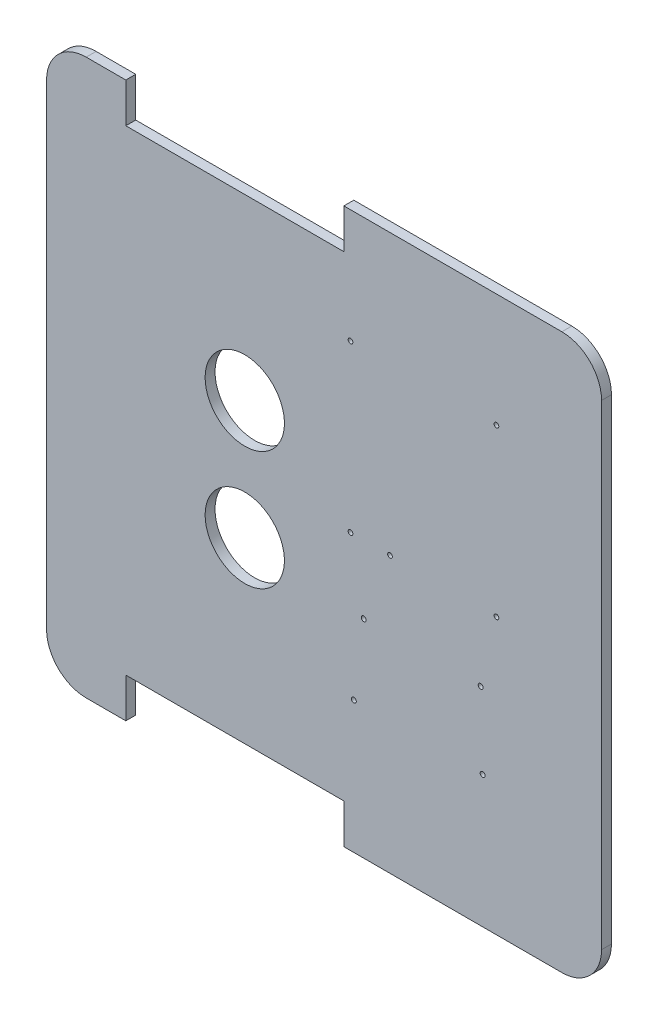
ISO-10303-21;
HEADER;
FILE_DESCRIPTION(('STEP AP214'),'2;1');
FILE_NAME('part.step','',(''),(''),'','','');
FILE_SCHEMA(('AUTOMOTIVE_DESIGN { 1 0 10303 214 1 1 1 1 }'));
ENDSEC;
DATA;
#1=APPLICATION_CONTEXT('core data for automotive mechanical design processes');
#2=APPLICATION_PROTOCOL_DEFINITION('international standard','automotive_design',2000,#1);
#3=PRODUCT_CONTEXT('',#1,'mechanical');
#4=PRODUCT('Part','Part','',(#3));
#5=PRODUCT_RELATED_PRODUCT_CATEGORY('part','',(#4));
#6=PRODUCT_DEFINITION_FORMATION('','',#4);
#7=PRODUCT_DEFINITION_CONTEXT('part definition',#1,'design');
#8=PRODUCT_DEFINITION('design','',#6,#7);
#9=PRODUCT_DEFINITION_SHAPE('','',#8);
#10=(LENGTH_UNIT() NAMED_UNIT(*) SI_UNIT(.MILLI.,.METRE.));
#11=(NAMED_UNIT(*) PLANE_ANGLE_UNIT() SI_UNIT($,.RADIAN.));
#12=(NAMED_UNIT(*) SI_UNIT($,.STERADIAN.) SOLID_ANGLE_UNIT());
#13=UNCERTAINTY_MEASURE_WITH_UNIT(LENGTH_MEASURE(1.E-05),#10,'distance_accuracy_value','');
#14=(GEOMETRIC_REPRESENTATION_CONTEXT(3) GLOBAL_UNCERTAINTY_ASSIGNED_CONTEXT((#13)) GLOBAL_UNIT_ASSIGNED_CONTEXT((#10,
#11,#12)) REPRESENTATION_CONTEXT('',''));
#15=CARTESIAN_POINT('',(0.,0.,0.));
#16=DIRECTION('',(0.,0.,1.));
#17=DIRECTION('',(1.,0.,0.));
#18=AXIS2_PLACEMENT_3D('',#15,#16,#17);
#19=CARTESIAN_POINT('',(25.4000000000002,0.,6.35));
#20=DIRECTION('',(0.,1.,0.));
#21=DIRECTION('',(0.,0.,1.));
#22=AXIS2_PLACEMENT_3D('',#19,#20,#21);
#23=PLANE('',#22);
#24=DIRECTION('',(1.,0.,0.));
#25=VECTOR('',#24,1.);
#26=CARTESIAN_POINT('',(25.4000000000002,0.,6.35));
#27=LINE('',#26,#25);
#28=CARTESIAN_POINT('',(190.5,0.,6.35));
#29=VERTEX_POINT('',#28);
#30=CARTESIAN_POINT('',(330.2,0.,6.35));
#31=VERTEX_POINT('',#30);
#32=EDGE_CURVE('E161',#29,#31,#27,.T.);
#33=ORIENTED_EDGE('',*,*,#32,.F.);
#34=DIRECTION('',(0.,0.,-1.));
#35=VECTOR('',#34,1.);
#36=CARTESIAN_POINT('',(190.5,0.,6.35));
#37=LINE('',#36,#35);
#38=CARTESIAN_POINT('',(190.5,0.,0.));
#39=VERTEX_POINT('',#38);
#40=EDGE_CURVE('E147',#29,#39,#37,.T.);
#41=ORIENTED_EDGE('',*,*,#40,.T.);
#42=DIRECTION('',(1.,0.,0.));
#43=VECTOR('',#42,1.);
#44=CARTESIAN_POINT('',(25.4000000000002,0.,0.));
#45=LINE('',#44,#43);
#46=CARTESIAN_POINT('',(330.2,0.,0.));
#47=VERTEX_POINT('',#46);
#48=EDGE_CURVE('E197',#39,#47,#45,.T.);
#49=ORIENTED_EDGE('',*,*,#48,.T.);
#50=DIRECTION('',(0.,0.,-1.));
#51=VECTOR('',#50,1.);
#52=CARTESIAN_POINT('',(330.2,0.,6.35));
#53=LINE('',#52,#51);
#54=EDGE_CURVE('E41',#31,#47,#53,.T.);
#55=ORIENTED_EDGE('',*,*,#54,.F.);
#56=EDGE_LOOP('',(#33,#41,#49,#55));
#57=FACE_BOUND('',#56,.T.);
#58=ADVANCED_FACE('F33',(#57),#23,.F.);
#59=CARTESIAN_POINT('',(25.4000000000002,355.6,6.35));
#60=DIRECTION('',(0.,-1.,0.));
#61=DIRECTION('',(0.,0.,-1.));
#62=AXIS2_PLACEMENT_3D('',#59,#60,#61);
#63=PLANE('',#62);
#64=DIRECTION('',(-1.,0.,0.));
#65=VECTOR('',#64,1.);
#66=CARTESIAN_POINT('',(25.4000000000002,355.6,0.));
#67=LINE('',#66,#65);
#68=CARTESIAN_POINT('',(330.2,355.6,0.));
#69=VERTEX_POINT('',#68);
#70=CARTESIAN_POINT('',(190.5,355.6,0.));
#71=VERTEX_POINT('',#70);
#72=EDGE_CURVE('E209',#69,#71,#67,.T.);
#73=ORIENTED_EDGE('',*,*,#72,.T.);
#74=DIRECTION('',(0.,0.,-1.));
#75=VECTOR('',#74,1.);
#76=CARTESIAN_POINT('',(190.5,355.6,6.35));
#77=LINE('',#76,#75);
#78=CARTESIAN_POINT('',(190.5,355.6,6.35));
#79=VERTEX_POINT('',#78);
#80=EDGE_CURVE('E198',#79,#71,#77,.T.);
#81=ORIENTED_EDGE('',*,*,#80,.F.);
#82=DIRECTION('',(-1.,0.,0.));
#83=VECTOR('',#82,1.);
#84=CARTESIAN_POINT('',(25.4000000000002,355.6,6.35));
#85=LINE('',#84,#83);
#86=CARTESIAN_POINT('',(330.2,355.6,6.35));
#87=VERTEX_POINT('',#86);
#88=EDGE_CURVE('E186',#87,#79,#85,.T.);
#89=ORIENTED_EDGE('',*,*,#88,.F.);
#90=DIRECTION('',(0.,0.,-1.));
#91=VECTOR('',#90,1.);
#92=CARTESIAN_POINT('',(330.2,355.6,6.35));
#93=LINE('',#92,#91);
#94=EDGE_CURVE('E223',#87,#69,#93,.T.);
#95=ORIENTED_EDGE('',*,*,#94,.T.);
#96=EDGE_LOOP('',(#73,#81,#89,#95));
#97=FACE_BOUND('',#96,.T.);
#98=ADVANCED_FACE('F254',(#97),#63,.F.);
#99=CARTESIAN_POINT('',(25.4,25.4,6.35));
#100=DIRECTION('',(0.,0.,-1.));
#101=DIRECTION('',(-1.,0.,0.));
#102=AXIS2_PLACEMENT_3D('',#99,#100,#101);
#103=CYLINDRICAL_SURFACE('',#102,25.4);
#104=CARTESIAN_POINT('',(25.4,25.4,0.));
#105=DIRECTION('',(0.,0.,1.));
#106=DIRECTION('',(-1.,0.,0.));
#107=AXIS2_PLACEMENT_3D('',#104,#105,#106);
#108=CIRCLE('',#107,25.4);
#109=CARTESIAN_POINT('',(0.,25.4000000000002,0.));
#110=VERTEX_POINT('',#109);
#111=CARTESIAN_POINT('',(25.4000000000002,0.,0.));
#112=VERTEX_POINT('',#111);
#113=EDGE_CURVE('E194',#110,#112,#108,.T.);
#114=ORIENTED_EDGE('',*,*,#113,.T.);
#115=DIRECTION('',(0.,0.,-1.));
#116=VECTOR('',#115,1.);
#117=CARTESIAN_POINT('',(25.4000000000002,0.,6.35));
#118=LINE('',#117,#116);
#119=CARTESIAN_POINT('',(25.4000000000002,0.,6.35));
#120=VERTEX_POINT('',#119);
#121=EDGE_CURVE('E11',#120,#112,#118,.T.);
#122=ORIENTED_EDGE('',*,*,#121,.F.);
#123=CARTESIAN_POINT('',(25.4,25.4,6.35));
#124=DIRECTION('',(0.,0.,1.));
#125=DIRECTION('',(-1.,0.,0.));
#126=AXIS2_PLACEMENT_3D('',#123,#124,#125);
#127=CIRCLE('',#126,25.4);
#128=CARTESIAN_POINT('',(0.,25.4000000000002,6.35));
#129=VERTEX_POINT('',#128);
#130=EDGE_CURVE('E171',#129,#120,#127,.T.);
#131=ORIENTED_EDGE('',*,*,#130,.F.);
#132=DIRECTION('',(0.,0.,-1.));
#133=VECTOR('',#132,1.);
#134=CARTESIAN_POINT('',(0.,25.4000000000002,6.35));
#135=LINE('',#134,#133);
#136=EDGE_CURVE('E193',#129,#110,#135,.T.);
#137=ORIENTED_EDGE('',*,*,#136,.T.);
#138=EDGE_LOOP('',(#114,#122,#131,#137));
#139=FACE_BOUND('',#138,.T.);
#140=ADVANCED_FACE('F35',(#139),#103,.T.);
#141=CARTESIAN_POINT('',(50.8,0.,0.));
#142=VERTEX_POINT('',#141);
#143=EDGE_CURVE('E199',#112,#142,#45,.T.);
#144=ORIENTED_EDGE('',*,*,#143,.T.);
#145=DIRECTION('',(0.,0.,-1.));
#146=VECTOR('',#145,1.);
#147=CARTESIAN_POINT('',(50.8,0.,6.35));
#148=LINE('',#147,#146);
#149=CARTESIAN_POINT('',(50.8,0.,6.35));
#150=VERTEX_POINT('',#149);
#151=EDGE_CURVE('E48',#150,#142,#148,.T.);
#152=ORIENTED_EDGE('',*,*,#151,.F.);
#153=EDGE_CURVE('E170',#120,#150,#27,.T.);
#154=ORIENTED_EDGE('',*,*,#153,.F.);
#155=ORIENTED_EDGE('',*,*,#121,.T.);
#156=EDGE_LOOP('',(#144,#152,#154,#155));
#157=FACE_BOUND('',#156,.T.);
#158=ADVANCED_FACE('F412',(#157),#23,.F.);
#159=CARTESIAN_POINT('',(330.2,25.4,6.35));
#160=DIRECTION('',(0.,0.,-1.));
#161=DIRECTION('',(-1.,0.,0.));
#162=AXIS2_PLACEMENT_3D('',#159,#160,#161);
#163=CYLINDRICAL_SURFACE('',#162,25.4);
#164=CARTESIAN_POINT('',(330.2,25.4,0.));
#165=DIRECTION('',(0.,0.,1.));
#166=DIRECTION('',(1.,0.,0.));
#167=AXIS2_PLACEMENT_3D('',#164,#165,#166);
#168=CIRCLE('',#167,25.4);
#169=CARTESIAN_POINT('',(355.6,25.4000000000002,0.));
#170=VERTEX_POINT('',#169);
#171=EDGE_CURVE('E202',#47,#170,#168,.T.);
#172=ORIENTED_EDGE('',*,*,#171,.T.);
#173=DIRECTION('',(0.,0.,-1.));
#174=VECTOR('',#173,1.);
#175=CARTESIAN_POINT('',(355.6,25.4000000000002,6.35));
#176=LINE('',#175,#174);
#177=CARTESIAN_POINT('',(355.6,25.4000000000002,6.35));
#178=VERTEX_POINT('',#177);
#179=EDGE_CURVE('E229',#178,#170,#176,.T.);
#180=ORIENTED_EDGE('',*,*,#179,.F.);
#181=CARTESIAN_POINT('',(330.2,25.4,6.35));
#182=DIRECTION('',(0.,0.,1.));
#183=DIRECTION('',(1.,0.,0.));
#184=AXIS2_PLACEMENT_3D('',#181,#182,#183);
#185=CIRCLE('',#184,25.4);
#186=EDGE_CURVE('E174',#31,#178,#185,.T.);
#187=ORIENTED_EDGE('',*,*,#186,.F.);
#188=ORIENTED_EDGE('',*,*,#54,.T.);
#189=EDGE_LOOP('',(#172,#180,#187,#188));
#190=FACE_BOUND('',#189,.T.);
#191=ADVANCED_FACE('F233',(#190),#163,.T.);
#192=CARTESIAN_POINT('',(355.6,25.4000000000002,6.35));
#193=DIRECTION('',(-1.,0.,0.));
#194=DIRECTION('',(0.,0.,1.));
#195=AXIS2_PLACEMENT_3D('',#192,#193,#194);
#196=PLANE('',#195);
#197=DIRECTION('',(0.,1.,0.));
#198=VECTOR('',#197,1.);
#199=CARTESIAN_POINT('',(355.6,25.4000000000002,0.));
#200=LINE('',#199,#198);
#201=CARTESIAN_POINT('',(355.6,330.2,0.));
#202=VERTEX_POINT('',#201);
#203=EDGE_CURVE('E204',#170,#202,#200,.T.);
#204=ORIENTED_EDGE('',*,*,#203,.T.);
#205=DIRECTION('',(0.,0.,-1.));
#206=VECTOR('',#205,1.);
#207=CARTESIAN_POINT('',(355.6,330.2,6.35));
#208=LINE('',#207,#206);
#209=CARTESIAN_POINT('',(355.6,330.2,6.35));
#210=VERTEX_POINT('',#209);
#211=EDGE_CURVE('E226',#210,#202,#208,.T.);
#212=ORIENTED_EDGE('',*,*,#211,.F.);
#213=DIRECTION('',(0.,1.,0.));
#214=VECTOR('',#213,1.);
#215=CARTESIAN_POINT('',(355.6,25.4000000000002,6.35));
#216=LINE('',#215,#214);
#217=EDGE_CURVE('E181',#178,#210,#216,.T.);
#218=ORIENTED_EDGE('',*,*,#217,.F.);
#219=ORIENTED_EDGE('',*,*,#179,.T.);
#220=EDGE_LOOP('',(#204,#212,#218,#219));
#221=FACE_BOUND('',#220,.T.);
#222=ADVANCED_FACE('F242',(#221),#196,.F.);
#223=CARTESIAN_POINT('',(330.2,330.2,6.35));
#224=DIRECTION('',(0.,0.,-1.));
#225=DIRECTION('',(-1.,0.,0.));
#226=AXIS2_PLACEMENT_3D('',#223,#224,#225);
#227=CYLINDRICAL_SURFACE('',#226,25.4);
#228=CARTESIAN_POINT('',(330.2,330.2,0.));
#229=DIRECTION('',(0.,0.,1.));
#230=DIRECTION('',(-1.,0.,0.));
#231=AXIS2_PLACEMENT_3D('',#228,#229,#230);
#232=CIRCLE('',#231,25.4);
#233=EDGE_CURVE('E206',#202,#69,#232,.T.);
#234=ORIENTED_EDGE('',*,*,#233,.T.);
#235=ORIENTED_EDGE('',*,*,#94,.F.);
#236=CARTESIAN_POINT('',(330.2,330.2,6.35));
#237=DIRECTION('',(0.,0.,1.));
#238=DIRECTION('',(-1.,0.,0.));
#239=AXIS2_PLACEMENT_3D('',#236,#237,#238);
#240=CIRCLE('',#239,25.4);
#241=EDGE_CURVE('E183',#210,#87,#240,.T.);
#242=ORIENTED_EDGE('',*,*,#241,.F.);
#243=ORIENTED_EDGE('',*,*,#211,.T.);
#244=EDGE_LOOP('',(#234,#235,#242,#243));
#245=FACE_BOUND('',#244,.T.);
#246=ADVANCED_FACE('F246',(#245),#227,.T.);
#247=CARTESIAN_POINT('',(50.8,355.6,6.35));
#248=VERTEX_POINT('',#247);
#249=CARTESIAN_POINT('',(25.4000000000002,355.6,6.35));
#250=VERTEX_POINT('',#249);
#251=EDGE_CURVE('E185',#248,#250,#85,.T.);
#252=ORIENTED_EDGE('',*,*,#251,.F.);
#253=DIRECTION('',(0.,0.,-1.));
#254=VECTOR('',#253,1.);
#255=CARTESIAN_POINT('',(50.8,355.6,6.35));
#256=LINE('',#255,#254);
#257=CARTESIAN_POINT('',(50.8,355.6,0.));
#258=VERTEX_POINT('',#257);
#259=EDGE_CURVE('E255',#248,#258,#256,.T.);
#260=ORIENTED_EDGE('',*,*,#259,.T.);
#261=CARTESIAN_POINT('',(25.4000000000002,355.6,0.));
#262=VERTEX_POINT('',#261);
#263=EDGE_CURVE('E208',#258,#262,#67,.T.);
#264=ORIENTED_EDGE('',*,*,#263,.T.);
#265=DIRECTION('',(0.,0.,-1.));
#266=VECTOR('',#265,1.);
#267=CARTESIAN_POINT('',(25.4000000000002,355.6,6.35));
#268=LINE('',#267,#266);
#269=EDGE_CURVE('E220',#250,#262,#268,.T.);
#270=ORIENTED_EDGE('',*,*,#269,.F.);
#271=EDGE_LOOP('',(#252,#260,#264,#270));
#272=FACE_BOUND('',#271,.T.);
#273=ADVANCED_FACE('F417',(#272),#63,.F.);
#274=CARTESIAN_POINT('',(25.4,330.2,6.35));
#275=DIRECTION('',(0.,0.,-1.));
#276=DIRECTION('',(-1.,0.,0.));
#277=AXIS2_PLACEMENT_3D('',#274,#275,#276);
#278=CYLINDRICAL_SURFACE('',#277,25.4);
#279=CARTESIAN_POINT('',(25.4,330.2,0.));
#280=DIRECTION('',(0.,0.,1.));
#281=DIRECTION('',(-1.,0.,0.));
#282=AXIS2_PLACEMENT_3D('',#279,#280,#281);
#283=CIRCLE('',#282,25.4);
#284=CARTESIAN_POINT('',(0.,330.2,0.));
#285=VERTEX_POINT('',#284);
#286=EDGE_CURVE('E212',#262,#285,#283,.T.);
#287=ORIENTED_EDGE('',*,*,#286,.T.);
#288=DIRECTION('',(0.,0.,-1.));
#289=VECTOR('',#288,1.);
#290=CARTESIAN_POINT('',(0.,330.2,6.35));
#291=LINE('',#290,#289);
#292=CARTESIAN_POINT('',(0.,330.2,6.35));
#293=VERTEX_POINT('',#292);
#294=EDGE_CURVE('E217',#293,#285,#291,.T.);
#295=ORIENTED_EDGE('',*,*,#294,.F.);
#296=CARTESIAN_POINT('',(25.4,330.2,6.35));
#297=DIRECTION('',(0.,0.,1.));
#298=DIRECTION('',(-1.,0.,0.));
#299=AXIS2_PLACEMENT_3D('',#296,#297,#298);
#300=CIRCLE('',#299,25.4);
#301=EDGE_CURVE('E189',#250,#293,#300,.T.);
#302=ORIENTED_EDGE('',*,*,#301,.F.);
#303=ORIENTED_EDGE('',*,*,#269,.T.);
#304=EDGE_LOOP('',(#287,#295,#302,#303));
#305=FACE_BOUND('',#304,.T.);
#306=ADVANCED_FACE('F440',(#305),#278,.T.);
#307=CARTESIAN_POINT('',(0.,25.4000000000002,6.35));
#308=DIRECTION('',(1.,0.,0.));
#309=DIRECTION('',(0.,0.,-1.));
#310=AXIS2_PLACEMENT_3D('',#307,#308,#309);
#311=PLANE('',#310);
#312=DIRECTION('',(0.,-1.,0.));
#313=VECTOR('',#312,1.);
#314=CARTESIAN_POINT('',(0.,25.4000000000002,0.));
#315=LINE('',#314,#313);
#316=EDGE_CURVE('E176',#285,#110,#315,.T.);
#317=ORIENTED_EDGE('',*,*,#316,.T.);
#318=ORIENTED_EDGE('',*,*,#136,.F.);
#319=DIRECTION('',(0.,-1.,0.));
#320=VECTOR('',#319,1.);
#321=CARTESIAN_POINT('',(0.,25.4000000000002,6.35));
#322=LINE('',#321,#320);
#323=EDGE_CURVE('E191',#293,#129,#322,.T.);
#324=ORIENTED_EDGE('',*,*,#323,.F.);
#325=ORIENTED_EDGE('',*,*,#294,.T.);
#326=EDGE_LOOP('',(#317,#318,#324,#325));
#327=FACE_BOUND('',#326,.T.);
#328=ADVANCED_FACE('F435',(#327),#311,.F.);
#329=CARTESIAN_POINT('',(25.4,25.4,6.35));
#330=DIRECTION('',(0.,0.,-1.));
#331=DIRECTION('',(-1.,0.,0.));
#332=AXIS2_PLACEMENT_3D('',#329,#330,#331);
#333=PLANE('',#332);
#334=CARTESIAN_POINT('',(127.,139.7,6.35));
#335=DIRECTION('',(0.,0.,-1.));
#336=DIRECTION('',(-1.,0.,0.));
#337=AXIS2_PLACEMENT_3D('',#334,#335,#336);
#338=CIRCLE('',#337,25.4);
#339=CARTESIAN_POINT('',(101.6,139.7,6.35));
#340=VERTEX_POINT('',#339);
#341=EDGE_CURVE('E352',#340,#340,#338,.T.);
#342=ORIENTED_EDGE('',*,*,#341,.T.);
#343=EDGE_LOOP('',(#342));
#344=FACE_BOUND('',#343,.T.);
#345=CARTESIAN_POINT('',(127.,215.9,6.35));
#346=DIRECTION('',(0.,0.,-1.));
#347=DIRECTION('',(-1.,0.,0.));
#348=AXIS2_PLACEMENT_3D('',#345,#346,#347);
#349=CIRCLE('',#348,25.4);
#350=CARTESIAN_POINT('',(101.6,215.9,6.35));
#351=VERTEX_POINT('',#350);
#352=EDGE_CURVE('E346',#351,#351,#349,.T.);
#353=ORIENTED_EDGE('',*,*,#352,.T.);
#354=EDGE_LOOP('',(#353));
#355=FACE_BOUND('',#354,.T.);
#356=CARTESIAN_POINT('',(194.758815439004,282.77206673186,6.35));
#357=DIRECTION('',(0.,0.,-1.));
#358=DIRECTION('',(-1.,0.,0.));
#359=AXIS2_PLACEMENT_3D('',#356,#357,#358);
#360=CIRCLE('',#359,1.49999999999994);
#361=CARTESIAN_POINT('',(193.258815439004,282.77206673186,6.35));
#362=VERTEX_POINT('',#361);
#363=EDGE_CURVE('E340',#362,#362,#360,.T.);
#364=ORIENTED_EDGE('',*,*,#363,.T.);
#365=EDGE_LOOP('',(#364));
#366=FACE_BOUND('',#365,.T.);
#367=CARTESIAN_POINT('',(288.258815439004,282.77206673186,6.35));
#368=DIRECTION('',(0.,0.,-1.));
#369=DIRECTION('',(-1.,0.,0.));
#370=AXIS2_PLACEMENT_3D('',#367,#368,#369);
#371=CIRCLE('',#370,1.49999999999997);
#372=CARTESIAN_POINT('',(286.758815439004,282.77206673186,6.35));
#373=VERTEX_POINT('',#372);
#374=EDGE_CURVE('E334',#373,#373,#371,.T.);
#375=ORIENTED_EDGE('',*,*,#374,.T.);
#376=EDGE_LOOP('',(#375));
#377=FACE_BOUND('',#376,.T.);
#378=CARTESIAN_POINT('',(194.758815439004,176.47206673186,6.35));
#379=DIRECTION('',(0.,0.,-1.));
#380=DIRECTION('',(-1.,0.,0.));
#381=AXIS2_PLACEMENT_3D('',#378,#379,#380);
#382=CIRCLE('',#381,1.49999999999994);
#383=CARTESIAN_POINT('',(193.258815439004,176.47206673186,6.35));
#384=VERTEX_POINT('',#383);
#385=EDGE_CURVE('E328',#384,#384,#382,.T.);
#386=ORIENTED_EDGE('',*,*,#385,.T.);
#387=EDGE_LOOP('',(#386));
#388=FACE_BOUND('',#387,.T.);
#389=CARTESIAN_POINT('',(220.058815439004,176.47206673186,6.35));
#390=DIRECTION('',(0.,0.,-1.));
#391=DIRECTION('',(-1.,0.,0.));
#392=AXIS2_PLACEMENT_3D('',#389,#390,#391);
#393=CIRCLE('',#392,1.49999999999994);
#394=CARTESIAN_POINT('',(218.558815439004,176.47206673186,6.35));
#395=VERTEX_POINT('',#394);
#396=EDGE_CURVE('E322',#395,#395,#393,.T.);
#397=ORIENTED_EDGE('',*,*,#396,.T.);
#398=EDGE_LOOP('',(#397));
#399=FACE_BOUND('',#398,.T.);
#400=CARTESIAN_POINT('',(288.258815439004,176.47206673186,6.35));
#401=DIRECTION('',(0.,0.,-1.));
#402=DIRECTION('',(-1.,0.,0.));
#403=AXIS2_PLACEMENT_3D('',#400,#401,#402);
#404=CIRCLE('',#403,1.49999999999996);
#405=CARTESIAN_POINT('',(286.758815439004,176.47206673186,6.35));
#406=VERTEX_POINT('',#405);
#407=EDGE_CURVE('E316',#406,#406,#404,.T.);
#408=ORIENTED_EDGE('',*,*,#407,.T.);
#409=EDGE_LOOP('',(#408));
#410=FACE_BOUND('',#409,.T.);
#411=CARTESIAN_POINT('',(203.223181490259,132.833787041944,6.35));
#412=DIRECTION('',(0.,0.,-1.));
#413=DIRECTION('',(-1.,0.,0.));
#414=AXIS2_PLACEMENT_3D('',#411,#412,#413);
#415=CIRCLE('',#414,1.58750000000001);
#416=CARTESIAN_POINT('',(201.635681490259,132.833787041944,6.35));
#417=VERTEX_POINT('',#416);
#418=EDGE_CURVE('E310',#417,#417,#415,.T.);
#419=ORIENTED_EDGE('',*,*,#418,.T.);
#420=EDGE_LOOP('',(#419));
#421=FACE_BOUND('',#420,.T.);
#422=CARTESIAN_POINT('',(196.87318149026,84.5737870419438,6.35));
#423=DIRECTION('',(0.,0.,-1.));
#424=DIRECTION('',(-1.,0.,0.));
#425=AXIS2_PLACEMENT_3D('',#422,#423,#424);
#426=CIRCLE('',#425,1.58749999999995);
#427=CARTESIAN_POINT('',(195.28568149026,84.5737870419438,6.35));
#428=VERTEX_POINT('',#427);
#429=EDGE_CURVE('E304',#428,#428,#426,.T.);
#430=ORIENTED_EDGE('',*,*,#429,.T.);
#431=EDGE_LOOP('',(#430));
#432=FACE_BOUND('',#431,.T.);
#433=CARTESIAN_POINT('',(278.153181490259,132.833787041944,6.35));
#434=DIRECTION('',(0.,0.,-1.));
#435=DIRECTION('',(-1.,0.,0.));
#436=AXIS2_PLACEMENT_3D('',#433,#434,#435);
#437=CIRCLE('',#436,1.58749999999999);
#438=CARTESIAN_POINT('',(276.56568149026,132.833787041944,6.35));
#439=VERTEX_POINT('',#438);
#440=EDGE_CURVE('E298',#439,#439,#437,.T.);
#441=ORIENTED_EDGE('',*,*,#440,.T.);
#442=EDGE_LOOP('',(#441));
#443=FACE_BOUND('',#442,.T.);
#444=CARTESIAN_POINT('',(279.42318149026,84.5737870419439,6.35));
#445=DIRECTION('',(0.,0.,-1.));
#446=DIRECTION('',(-1.,0.,0.));
#447=AXIS2_PLACEMENT_3D('',#444,#445,#446);
#448=CIRCLE('',#447,1.58749999999998);
#449=CARTESIAN_POINT('',(277.83568149026,84.5737870419439,6.35));
#450=VERTEX_POINT('',#449);
#451=EDGE_CURVE('E292',#450,#450,#448,.T.);
#452=ORIENTED_EDGE('',*,*,#451,.T.);
#453=EDGE_LOOP('',(#452));
#454=FACE_BOUND('',#453,.T.);
#455=DIRECTION('',(1.,0.,0.));
#456=VECTOR('',#455,1.);
#457=CARTESIAN_POINT('',(190.5,25.4,6.35));
#458=LINE('',#457,#456);
#459=CARTESIAN_POINT('',(50.8,25.4,6.35));
#460=VERTEX_POINT('',#459);
#461=CARTESIAN_POINT('',(190.5,25.4,6.35));
#462=VERTEX_POINT('',#461);
#463=EDGE_CURVE('E157',#460,#462,#458,.T.);
#464=ORIENTED_EDGE('',*,*,#463,.T.);
#465=DIRECTION('',(0.,-1.,0.));
#466=VECTOR('',#465,1.);
#467=CARTESIAN_POINT('',(190.5,25.4,6.35));
#468=LINE('',#467,#466);
#469=EDGE_CURVE('E150',#462,#29,#468,.T.);
#470=ORIENTED_EDGE('',*,*,#469,.T.);
#471=ORIENTED_EDGE('',*,*,#32,.T.);
#472=ORIENTED_EDGE('',*,*,#186,.T.);
#473=ORIENTED_EDGE('',*,*,#217,.T.);
#474=ORIENTED_EDGE('',*,*,#241,.T.);
#475=ORIENTED_EDGE('',*,*,#88,.T.);
#476=DIRECTION('',(0.,-1.,0.));
#477=VECTOR('',#476,1.);
#478=CARTESIAN_POINT('',(190.5,355.6,6.35));
#479=LINE('',#478,#477);
#480=CARTESIAN_POINT('',(190.5,330.2,6.35));
#481=VERTEX_POINT('',#480);
#482=EDGE_CURVE('E251',#79,#481,#479,.T.);
#483=ORIENTED_EDGE('',*,*,#482,.T.);
#484=DIRECTION('',(-1.,0.,0.));
#485=VECTOR('',#484,1.);
#486=CARTESIAN_POINT('',(190.5,330.2,6.35));
#487=LINE('',#486,#485);
#488=CARTESIAN_POINT('',(50.8,330.2,6.35));
#489=VERTEX_POINT('',#488);
#490=EDGE_CURVE('E271',#481,#489,#487,.T.);
#491=ORIENTED_EDGE('',*,*,#490,.T.);
#492=DIRECTION('',(0.,1.,0.));
#493=VECTOR('',#492,1.);
#494=CARTESIAN_POINT('',(50.8,355.6,6.35));
#495=LINE('',#494,#493);
#496=EDGE_CURVE('E265',#489,#248,#495,.T.);
#497=ORIENTED_EDGE('',*,*,#496,.T.);
#498=ORIENTED_EDGE('',*,*,#251,.T.);
#499=ORIENTED_EDGE('',*,*,#301,.T.);
#500=ORIENTED_EDGE('',*,*,#323,.T.);
#501=ORIENTED_EDGE('',*,*,#130,.T.);
#502=ORIENTED_EDGE('',*,*,#153,.T.);
#503=DIRECTION('',(0.,1.,0.));
#504=VECTOR('',#503,1.);
#505=CARTESIAN_POINT('',(50.8,25.4,6.35));
#506=LINE('',#505,#504);
#507=EDGE_CURVE('E165',#150,#460,#506,.T.);
#508=ORIENTED_EDGE('',*,*,#507,.T.);
#509=EDGE_LOOP('',(#464,#470,#471,#472,#473,#474,#475,#483,#491,#497,#498,#499,#500,#501,#502,#508));
#510=FACE_BOUND('',#509,.T.);
#511=ADVANCED_FACE('F160',(#344,#355,#366,#377,#388,#399,#410,#421,#432,#443,#454,#510),#333,.F.);
#512=CARTESIAN_POINT('',(25.4,25.4,0.));
#513=DIRECTION('',(0.,0.,-1.));
#514=DIRECTION('',(-1.,0.,0.));
#515=AXIS2_PLACEMENT_3D('',#512,#513,#514);
#516=PLANE('',#515);
#517=CARTESIAN_POINT('',(127.,139.7,0.));
#518=DIRECTION('',(0.,0.,-1.));
#519=DIRECTION('',(-1.,0.,0.));
#520=AXIS2_PLACEMENT_3D('',#517,#518,#519);
#521=CIRCLE('',#520,25.4);
#522=CARTESIAN_POINT('',(101.6,139.7,0.));
#523=VERTEX_POINT('',#522);
#524=EDGE_CURVE('E355',#523,#523,#521,.T.);
#525=ORIENTED_EDGE('',*,*,#524,.F.);
#526=EDGE_LOOP('',(#525));
#527=FACE_BOUND('',#526,.T.);
#528=CARTESIAN_POINT('',(127.,215.9,0.));
#529=DIRECTION('',(0.,0.,-1.));
#530=DIRECTION('',(-1.,0.,0.));
#531=AXIS2_PLACEMENT_3D('',#528,#529,#530);
#532=CIRCLE('',#531,25.4);
#533=CARTESIAN_POINT('',(101.6,215.9,0.));
#534=VERTEX_POINT('',#533);
#535=EDGE_CURVE('E349',#534,#534,#532,.T.);
#536=ORIENTED_EDGE('',*,*,#535,.F.);
#537=EDGE_LOOP('',(#536));
#538=FACE_BOUND('',#537,.T.);
#539=CARTESIAN_POINT('',(194.758815439004,282.77206673186,0.));
#540=DIRECTION('',(0.,0.,-1.));
#541=DIRECTION('',(-1.,0.,0.));
#542=AXIS2_PLACEMENT_3D('',#539,#540,#541);
#543=CIRCLE('',#542,1.49999999999994);
#544=CARTESIAN_POINT('',(193.258815439004,282.77206673186,0.));
#545=VERTEX_POINT('',#544);
#546=EDGE_CURVE('E343',#545,#545,#543,.T.);
#547=ORIENTED_EDGE('',*,*,#546,.F.);
#548=EDGE_LOOP('',(#547));
#549=FACE_BOUND('',#548,.T.);
#550=CARTESIAN_POINT('',(288.258815439004,282.77206673186,0.));
#551=DIRECTION('',(0.,0.,-1.));
#552=DIRECTION('',(-1.,0.,0.));
#553=AXIS2_PLACEMENT_3D('',#550,#551,#552);
#554=CIRCLE('',#553,1.49999999999997);
#555=CARTESIAN_POINT('',(286.758815439004,282.77206673186,0.));
#556=VERTEX_POINT('',#555);
#557=EDGE_CURVE('E337',#556,#556,#554,.T.);
#558=ORIENTED_EDGE('',*,*,#557,.F.);
#559=EDGE_LOOP('',(#558));
#560=FACE_BOUND('',#559,.T.);
#561=CARTESIAN_POINT('',(194.758815439004,176.47206673186,0.));
#562=DIRECTION('',(0.,0.,-1.));
#563=DIRECTION('',(-1.,0.,0.));
#564=AXIS2_PLACEMENT_3D('',#561,#562,#563);
#565=CIRCLE('',#564,1.49999999999994);
#566=CARTESIAN_POINT('',(193.258815439004,176.47206673186,0.));
#567=VERTEX_POINT('',#566);
#568=EDGE_CURVE('E331',#567,#567,#565,.T.);
#569=ORIENTED_EDGE('',*,*,#568,.F.);
#570=EDGE_LOOP('',(#569));
#571=FACE_BOUND('',#570,.T.);
#572=CARTESIAN_POINT('',(220.058815439004,176.47206673186,0.));
#573=DIRECTION('',(0.,0.,-1.));
#574=DIRECTION('',(-1.,0.,0.));
#575=AXIS2_PLACEMENT_3D('',#572,#573,#574);
#576=CIRCLE('',#575,1.49999999999994);
#577=CARTESIAN_POINT('',(218.558815439004,176.47206673186,0.));
#578=VERTEX_POINT('',#577);
#579=EDGE_CURVE('E325',#578,#578,#576,.T.);
#580=ORIENTED_EDGE('',*,*,#579,.F.);
#581=EDGE_LOOP('',(#580));
#582=FACE_BOUND('',#581,.T.);
#583=CARTESIAN_POINT('',(288.258815439004,176.47206673186,0.));
#584=DIRECTION('',(0.,0.,-1.));
#585=DIRECTION('',(-1.,0.,0.));
#586=AXIS2_PLACEMENT_3D('',#583,#584,#585);
#587=CIRCLE('',#586,1.49999999999996);
#588=CARTESIAN_POINT('',(286.758815439004,176.47206673186,0.));
#589=VERTEX_POINT('',#588);
#590=EDGE_CURVE('E319',#589,#589,#587,.T.);
#591=ORIENTED_EDGE('',*,*,#590,.F.);
#592=EDGE_LOOP('',(#591));
#593=FACE_BOUND('',#592,.T.);
#594=CARTESIAN_POINT('',(203.223181490259,132.833787041944,0.));
#595=DIRECTION('',(0.,0.,-1.));
#596=DIRECTION('',(-1.,0.,0.));
#597=AXIS2_PLACEMENT_3D('',#594,#595,#596);
#598=CIRCLE('',#597,1.58750000000001);
#599=CARTESIAN_POINT('',(201.635681490259,132.833787041944,0.));
#600=VERTEX_POINT('',#599);
#601=EDGE_CURVE('E313',#600,#600,#598,.T.);
#602=ORIENTED_EDGE('',*,*,#601,.F.);
#603=EDGE_LOOP('',(#602));
#604=FACE_BOUND('',#603,.T.);
#605=CARTESIAN_POINT('',(196.87318149026,84.5737870419438,0.));
#606=DIRECTION('',(0.,0.,-1.));
#607=DIRECTION('',(-1.,0.,0.));
#608=AXIS2_PLACEMENT_3D('',#605,#606,#607);
#609=CIRCLE('',#608,1.58749999999995);
#610=CARTESIAN_POINT('',(195.28568149026,84.5737870419438,0.));
#611=VERTEX_POINT('',#610);
#612=EDGE_CURVE('E307',#611,#611,#609,.T.);
#613=ORIENTED_EDGE('',*,*,#612,.F.);
#614=EDGE_LOOP('',(#613));
#615=FACE_BOUND('',#614,.T.);
#616=CARTESIAN_POINT('',(278.153181490259,132.833787041944,0.));
#617=DIRECTION('',(0.,0.,-1.));
#618=DIRECTION('',(-1.,0.,0.));
#619=AXIS2_PLACEMENT_3D('',#616,#617,#618);
#620=CIRCLE('',#619,1.58749999999999);
#621=CARTESIAN_POINT('',(276.56568149026,132.833787041944,0.));
#622=VERTEX_POINT('',#621);
#623=EDGE_CURVE('E301',#622,#622,#620,.T.);
#624=ORIENTED_EDGE('',*,*,#623,.F.);
#625=EDGE_LOOP('',(#624));
#626=FACE_BOUND('',#625,.T.);
#627=CARTESIAN_POINT('',(279.42318149026,84.5737870419439,0.));
#628=DIRECTION('',(0.,0.,-1.));
#629=DIRECTION('',(-1.,0.,0.));
#630=AXIS2_PLACEMENT_3D('',#627,#628,#629);
#631=CIRCLE('',#630,1.58749999999998);
#632=CARTESIAN_POINT('',(277.83568149026,84.5737870419439,0.));
#633=VERTEX_POINT('',#632);
#634=EDGE_CURVE('E295',#633,#633,#631,.T.);
#635=ORIENTED_EDGE('',*,*,#634,.F.);
#636=EDGE_LOOP('',(#635));
#637=FACE_BOUND('',#636,.T.);
#638=DIRECTION('',(0.,-1.,0.));
#639=VECTOR('',#638,1.);
#640=CARTESIAN_POINT('',(190.5,25.4,0.));
#641=LINE('',#640,#639);
#642=CARTESIAN_POINT('',(190.5,25.4,0.));
#643=VERTEX_POINT('',#642);
#644=EDGE_CURVE('E153',#643,#39,#641,.T.);
#645=ORIENTED_EDGE('',*,*,#644,.F.);
#646=DIRECTION('',(1.,0.,0.));
#647=VECTOR('',#646,1.);
#648=CARTESIAN_POINT('',(190.5,25.4,0.));
#649=LINE('',#648,#647);
#650=CARTESIAN_POINT('',(50.8,25.4,0.));
#651=VERTEX_POINT('',#650);
#652=EDGE_CURVE('E166',#651,#643,#649,.T.);
#653=ORIENTED_EDGE('',*,*,#652,.F.);
#654=DIRECTION('',(0.,1.,0.));
#655=VECTOR('',#654,1.);
#656=CARTESIAN_POINT('',(50.8,25.4,0.));
#657=LINE('',#656,#655);
#658=EDGE_CURVE('E289',#142,#651,#657,.T.);
#659=ORIENTED_EDGE('',*,*,#658,.F.);
#660=ORIENTED_EDGE('',*,*,#143,.F.);
#661=ORIENTED_EDGE('',*,*,#113,.F.);
#662=ORIENTED_EDGE('',*,*,#316,.F.);
#663=ORIENTED_EDGE('',*,*,#286,.F.);
#664=ORIENTED_EDGE('',*,*,#263,.F.);
#665=DIRECTION('',(0.,1.,0.));
#666=VECTOR('',#665,1.);
#667=CARTESIAN_POINT('',(50.8,355.6,0.));
#668=LINE('',#667,#666);
#669=CARTESIAN_POINT('',(50.8,330.2,0.));
#670=VERTEX_POINT('',#669);
#671=EDGE_CURVE('E261',#670,#258,#668,.T.);
#672=ORIENTED_EDGE('',*,*,#671,.F.);
#673=DIRECTION('',(-1.,0.,0.));
#674=VECTOR('',#673,1.);
#675=CARTESIAN_POINT('',(190.5,330.2,0.));
#676=LINE('',#675,#674);
#677=CARTESIAN_POINT('',(190.5,330.2,0.));
#678=VERTEX_POINT('',#677);
#679=EDGE_CURVE('E278',#678,#670,#676,.T.);
#680=ORIENTED_EDGE('',*,*,#679,.F.);
#681=DIRECTION('',(0.,-1.,0.));
#682=VECTOR('',#681,1.);
#683=CARTESIAN_POINT('',(190.5,355.6,0.));
#684=LINE('',#683,#682);
#685=EDGE_CURVE('E56',#71,#678,#684,.T.);
#686=ORIENTED_EDGE('',*,*,#685,.F.);
#687=ORIENTED_EDGE('',*,*,#72,.F.);
#688=ORIENTED_EDGE('',*,*,#233,.F.);
#689=ORIENTED_EDGE('',*,*,#203,.F.);
#690=ORIENTED_EDGE('',*,*,#171,.F.);
#691=ORIENTED_EDGE('',*,*,#48,.F.);
#692=EDGE_LOOP('',(#645,#653,#659,#660,#661,#662,#663,#664,#672,#680,#686,#687,#688,#689,#690,#691));
#693=FACE_BOUND('',#692,.T.);
#694=ADVANCED_FACE('F237',(#527,#538,#549,#560,#571,#582,#593,#604,#615,#626,#637,#693),#516,.T.);
#695=CARTESIAN_POINT('',(190.5,355.6,6.35));
#696=DIRECTION('',(1.,0.,0.));
#697=DIRECTION('',(0.,0.,-1.));
#698=AXIS2_PLACEMENT_3D('',#695,#696,#697);
#699=PLANE('',#698);
#700=ORIENTED_EDGE('',*,*,#685,.T.);
#701=DIRECTION('',(0.,0.,-1.));
#702=VECTOR('',#701,1.);
#703=CARTESIAN_POINT('',(190.5,330.2,6.35));
#704=LINE('',#703,#702);
#705=EDGE_CURVE('E264',#481,#678,#704,.T.);
#706=ORIENTED_EDGE('',*,*,#705,.F.);
#707=ORIENTED_EDGE('',*,*,#482,.F.);
#708=ORIENTED_EDGE('',*,*,#80,.T.);
#709=EDGE_LOOP('',(#700,#706,#707,#708));
#710=FACE_BOUND('',#709,.T.);
#711=ADVANCED_FACE('F372',(#710),#699,.F.);
#712=CARTESIAN_POINT('',(50.8,355.6,6.35));
#713=DIRECTION('',(-1.,0.,0.));
#714=DIRECTION('',(0.,0.,1.));
#715=AXIS2_PLACEMENT_3D('',#712,#713,#714);
#716=PLANE('',#715);
#717=ORIENTED_EDGE('',*,*,#671,.T.);
#718=ORIENTED_EDGE('',*,*,#259,.F.);
#719=ORIENTED_EDGE('',*,*,#496,.F.);
#720=DIRECTION('',(0.,0.,-1.));
#721=VECTOR('',#720,1.);
#722=CARTESIAN_POINT('',(50.8,330.2,6.35));
#723=LINE('',#722,#721);
#724=EDGE_CURVE('E258',#489,#670,#723,.T.);
#725=ORIENTED_EDGE('',*,*,#724,.T.);
#726=EDGE_LOOP('',(#717,#718,#719,#725));
#727=FACE_BOUND('',#726,.T.);
#728=ADVANCED_FACE('F444',(#727),#716,.F.);
#729=CARTESIAN_POINT('',(190.5,330.2,6.35));
#730=DIRECTION('',(0.,-1.,0.));
#731=DIRECTION('',(0.,0.,-1.));
#732=AXIS2_PLACEMENT_3D('',#729,#730,#731);
#733=PLANE('',#732);
#734=ORIENTED_EDGE('',*,*,#679,.T.);
#735=ORIENTED_EDGE('',*,*,#724,.F.);
#736=ORIENTED_EDGE('',*,*,#490,.F.);
#737=ORIENTED_EDGE('',*,*,#705,.T.);
#738=EDGE_LOOP('',(#734,#735,#736,#737));
#739=FACE_BOUND('',#738,.T.);
#740=ADVANCED_FACE('F445',(#739),#733,.F.);
#741=CARTESIAN_POINT('',(190.5,25.4,6.35));
#742=DIRECTION('',(1.,0.,0.));
#743=DIRECTION('',(0.,0.,-1.));
#744=AXIS2_PLACEMENT_3D('',#741,#742,#743);
#745=PLANE('',#744);
#746=ORIENTED_EDGE('',*,*,#644,.T.);
#747=ORIENTED_EDGE('',*,*,#40,.F.);
#748=ORIENTED_EDGE('',*,*,#469,.F.);
#749=DIRECTION('',(0.,0.,-1.));
#750=VECTOR('',#749,1.);
#751=CARTESIAN_POINT('',(190.5,25.4,6.35));
#752=LINE('',#751,#750);
#753=EDGE_CURVE('E279',#462,#643,#752,.T.);
#754=ORIENTED_EDGE('',*,*,#753,.T.);
#755=EDGE_LOOP('',(#746,#747,#748,#754));
#756=FACE_BOUND('',#755,.T.);
#757=ADVANCED_FACE('F149',(#756),#745,.F.);
#758=CARTESIAN_POINT('',(190.5,25.4,6.35));
#759=DIRECTION('',(0.,1.,0.));
#760=DIRECTION('',(0.,0.,1.));
#761=AXIS2_PLACEMENT_3D('',#758,#759,#760);
#762=PLANE('',#761);
#763=ORIENTED_EDGE('',*,*,#652,.T.);
#764=ORIENTED_EDGE('',*,*,#753,.F.);
#765=ORIENTED_EDGE('',*,*,#463,.F.);
#766=DIRECTION('',(0.,0.,-1.));
#767=VECTOR('',#766,1.);
#768=CARTESIAN_POINT('',(50.8,25.4,6.35));
#769=LINE('',#768,#767);
#770=EDGE_CURVE('E284',#460,#651,#769,.T.);
#771=ORIENTED_EDGE('',*,*,#770,.T.);
#772=EDGE_LOOP('',(#763,#764,#765,#771));
#773=FACE_BOUND('',#772,.T.);
#774=ADVANCED_FACE('F407',(#773),#762,.F.);
#775=CARTESIAN_POINT('',(50.8,25.4,6.35));
#776=DIRECTION('',(-1.,0.,0.));
#777=DIRECTION('',(0.,-1.,0.));
#778=AXIS2_PLACEMENT_3D('',#775,#776,#777);
#779=PLANE('',#778);
#780=ORIENTED_EDGE('',*,*,#658,.T.);
#781=ORIENTED_EDGE('',*,*,#770,.F.);
#782=ORIENTED_EDGE('',*,*,#507,.F.);
#783=ORIENTED_EDGE('',*,*,#151,.T.);
#784=EDGE_LOOP('',(#780,#781,#782,#783));
#785=FACE_BOUND('',#784,.T.);
#786=ADVANCED_FACE('F397',(#785),#779,.F.);
#787=CARTESIAN_POINT('',(279.42318149026,84.5737870419439,6.35));
#788=DIRECTION('',(0.,0.,-1.));
#789=DIRECTION('',(-1.,0.,0.));
#790=AXIS2_PLACEMENT_3D('',#787,#788,#789);
#791=CYLINDRICAL_SURFACE('',#790,1.58749999999998);
#792=ORIENTED_EDGE('',*,*,#451,.F.);
#793=EDGE_LOOP('',(#792));
#794=FACE_BOUND('',#793,.T.);
#795=ORIENTED_EDGE('',*,*,#634,.T.);
#796=EDGE_LOOP('',(#795));
#797=FACE_BOUND('',#796,.T.);
#798=ADVANCED_FACE('F394',(#794,#797),#791,.F.);
#799=CARTESIAN_POINT('',(278.153181490259,132.833787041944,6.35));
#800=DIRECTION('',(0.,0.,-1.));
#801=DIRECTION('',(-1.,0.,0.));
#802=AXIS2_PLACEMENT_3D('',#799,#800,#801);
#803=CYLINDRICAL_SURFACE('',#802,1.58749999999999);
#804=ORIENTED_EDGE('',*,*,#440,.F.);
#805=EDGE_LOOP('',(#804));
#806=FACE_BOUND('',#805,.T.);
#807=ORIENTED_EDGE('',*,*,#623,.T.);
#808=EDGE_LOOP('',(#807));
#809=FACE_BOUND('',#808,.T.);
#810=ADVANCED_FACE('F396',(#806,#809),#803,.F.);
#811=CARTESIAN_POINT('',(196.87318149026,84.5737870419438,6.35));
#812=DIRECTION('',(0.,0.,-1.));
#813=DIRECTION('',(-1.,0.,0.));
#814=AXIS2_PLACEMENT_3D('',#811,#812,#813);
#815=CYLINDRICAL_SURFACE('',#814,1.58749999999995);
#816=ORIENTED_EDGE('',*,*,#429,.F.);
#817=EDGE_LOOP('',(#816));
#818=FACE_BOUND('',#817,.T.);
#819=ORIENTED_EDGE('',*,*,#612,.T.);
#820=EDGE_LOOP('',(#819));
#821=FACE_BOUND('',#820,.T.);
#822=ADVANCED_FACE('F404',(#818,#821),#815,.F.);
#823=CARTESIAN_POINT('',(203.223181490259,132.833787041944,6.35));
#824=DIRECTION('',(0.,0.,-1.));
#825=DIRECTION('',(-1.,0.,0.));
#826=AXIS2_PLACEMENT_3D('',#823,#824,#825);
#827=CYLINDRICAL_SURFACE('',#826,1.58750000000001);
#828=ORIENTED_EDGE('',*,*,#418,.F.);
#829=EDGE_LOOP('',(#828));
#830=FACE_BOUND('',#829,.T.);
#831=ORIENTED_EDGE('',*,*,#601,.T.);
#832=EDGE_LOOP('',(#831));
#833=FACE_BOUND('',#832,.T.);
#834=ADVANCED_FACE('F550',(#830,#833),#827,.F.);
#835=CARTESIAN_POINT('',(288.258815439004,176.47206673186,6.35));
#836=DIRECTION('',(0.,0.,-1.));
#837=DIRECTION('',(-1.,0.,0.));
#838=AXIS2_PLACEMENT_3D('',#835,#836,#837);
#839=CYLINDRICAL_SURFACE('',#838,1.49999999999996);
#840=ORIENTED_EDGE('',*,*,#407,.F.);
#841=EDGE_LOOP('',(#840));
#842=FACE_BOUND('',#841,.T.);
#843=ORIENTED_EDGE('',*,*,#590,.T.);
#844=EDGE_LOOP('',(#843));
#845=FACE_BOUND('',#844,.T.);
#846=ADVANCED_FACE('F559',(#842,#845),#839,.F.);
#847=CARTESIAN_POINT('',(220.058815439004,176.47206673186,6.35));
#848=DIRECTION('',(0.,0.,-1.));
#849=DIRECTION('',(-1.,0.,0.));
#850=AXIS2_PLACEMENT_3D('',#847,#848,#849);
#851=CYLINDRICAL_SURFACE('',#850,1.49999999999994);
#852=ORIENTED_EDGE('',*,*,#396,.F.);
#853=EDGE_LOOP('',(#852));
#854=FACE_BOUND('',#853,.T.);
#855=ORIENTED_EDGE('',*,*,#579,.T.);
#856=EDGE_LOOP('',(#855));
#857=FACE_BOUND('',#856,.T.);
#858=ADVANCED_FACE('F568',(#854,#857),#851,.F.);
#859=CARTESIAN_POINT('',(194.758815439004,176.47206673186,6.35));
#860=DIRECTION('',(0.,0.,-1.));
#861=DIRECTION('',(-1.,0.,0.));
#862=AXIS2_PLACEMENT_3D('',#859,#860,#861);
#863=CYLINDRICAL_SURFACE('',#862,1.49999999999994);
#864=ORIENTED_EDGE('',*,*,#385,.F.);
#865=EDGE_LOOP('',(#864));
#866=FACE_BOUND('',#865,.T.);
#867=ORIENTED_EDGE('',*,*,#568,.T.);
#868=EDGE_LOOP('',(#867));
#869=FACE_BOUND('',#868,.T.);
#870=ADVANCED_FACE('F577',(#866,#869),#863,.F.);
#871=CARTESIAN_POINT('',(288.258815439004,282.77206673186,6.35));
#872=DIRECTION('',(0.,0.,-1.));
#873=DIRECTION('',(-1.,0.,0.));
#874=AXIS2_PLACEMENT_3D('',#871,#872,#873);
#875=CYLINDRICAL_SURFACE('',#874,1.49999999999997);
#876=ORIENTED_EDGE('',*,*,#374,.F.);
#877=EDGE_LOOP('',(#876));
#878=FACE_BOUND('',#877,.T.);
#879=ORIENTED_EDGE('',*,*,#557,.T.);
#880=EDGE_LOOP('',(#879));
#881=FACE_BOUND('',#880,.T.);
#882=ADVANCED_FACE('F586',(#878,#881),#875,.F.);
#883=CARTESIAN_POINT('',(194.758815439004,282.77206673186,6.35));
#884=DIRECTION('',(0.,0.,-1.));
#885=DIRECTION('',(-1.,0.,0.));
#886=AXIS2_PLACEMENT_3D('',#883,#884,#885);
#887=CYLINDRICAL_SURFACE('',#886,1.49999999999994);
#888=ORIENTED_EDGE('',*,*,#363,.F.);
#889=EDGE_LOOP('',(#888));
#890=FACE_BOUND('',#889,.T.);
#891=ORIENTED_EDGE('',*,*,#546,.T.);
#892=EDGE_LOOP('',(#891));
#893=FACE_BOUND('',#892,.T.);
#894=ADVANCED_FACE('F595',(#890,#893),#887,.F.);
#895=CARTESIAN_POINT('',(127.,215.9,6.35));
#896=DIRECTION('',(0.,0.,-1.));
#897=DIRECTION('',(-1.,0.,0.));
#898=AXIS2_PLACEMENT_3D('',#895,#896,#897);
#899=CYLINDRICAL_SURFACE('',#898,25.4);
#900=ORIENTED_EDGE('',*,*,#352,.F.);
#901=EDGE_LOOP('',(#900));
#902=FACE_BOUND('',#901,.T.);
#903=ORIENTED_EDGE('',*,*,#535,.T.);
#904=EDGE_LOOP('',(#903));
#905=FACE_BOUND('',#904,.T.);
#906=ADVANCED_FACE('F366',(#902,#905),#899,.F.);
#907=CARTESIAN_POINT('',(127.,139.7,6.35));
#908=DIRECTION('',(0.,0.,-1.));
#909=DIRECTION('',(-1.,0.,0.));
#910=AXIS2_PLACEMENT_3D('',#907,#908,#909);
#911=CYLINDRICAL_SURFACE('',#910,25.4);
#912=ORIENTED_EDGE('',*,*,#341,.F.);
#913=EDGE_LOOP('',(#912));
#914=FACE_BOUND('',#913,.T.);
#915=ORIENTED_EDGE('',*,*,#524,.T.);
#916=EDGE_LOOP('',(#915));
#917=FACE_BOUND('',#916,.T.);
#918=ADVANCED_FACE('F363',(#914,#917),#911,.F.);
#919=CLOSED_SHELL('',(#58,#98,#140,#158,#191,#222,#246,#273,#306,#328,#511,#694,#711,#728,#740,
#757,#774,#786,#798,#810,#822,#834,#846,#858,#870,#882,#894,#906,#918));
#920=MANIFOLD_SOLID_BREP('B2',#919);
#921=ADVANCED_BREP_SHAPE_REPRESENTATION('',(#18,#920),#14);
#922=SHAPE_DEFINITION_REPRESENTATION(#9,#921);
ENDSEC;
END-ISO-10303-21;
